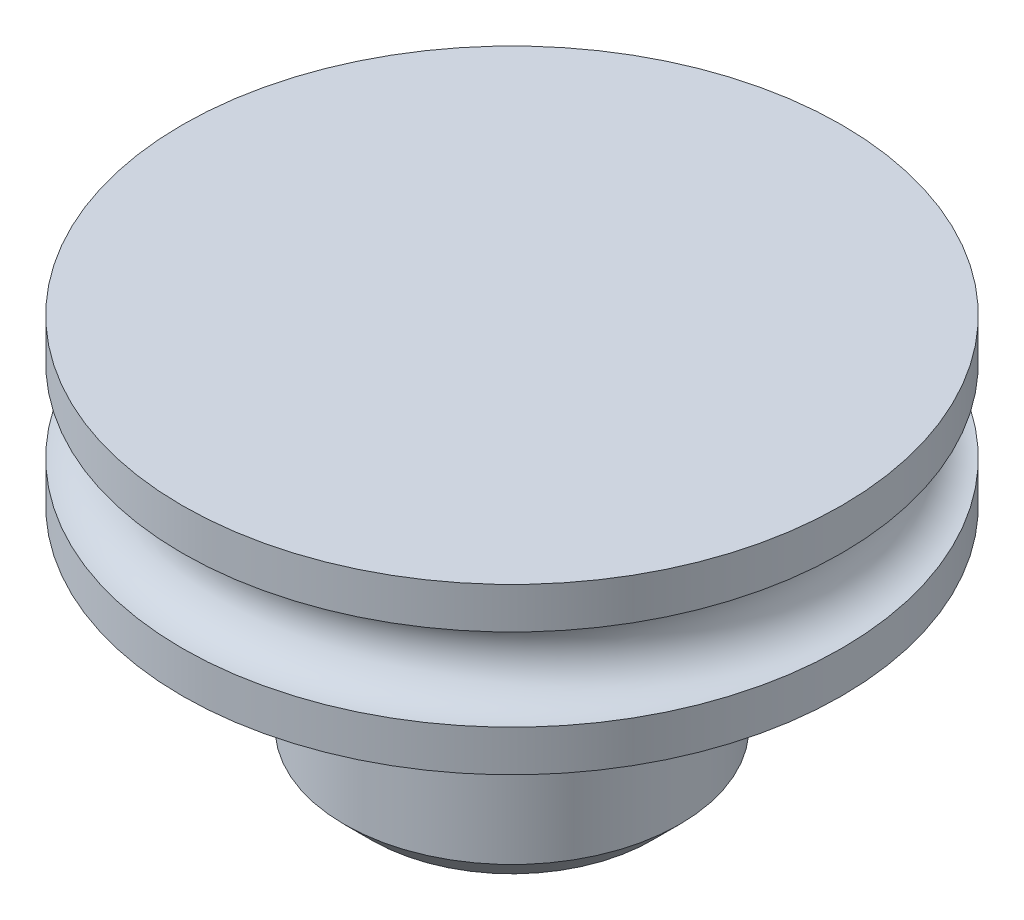
ISO-10303-21;
HEADER;
FILE_DESCRIPTION(('STEP AP214'),'2;1');
FILE_NAME('part.step','',(''),(''),'','','');
FILE_SCHEMA(('AUTOMOTIVE_DESIGN { 1 0 10303 214 1 1 1 1 }'));
ENDSEC;
DATA;
#1=APPLICATION_CONTEXT('core data for automotive mechanical design processes');
#2=APPLICATION_PROTOCOL_DEFINITION('international standard','automotive_design',2000,#1);
#3=PRODUCT_CONTEXT('',#1,'mechanical');
#4=PRODUCT('Part','Part','',(#3));
#5=PRODUCT_RELATED_PRODUCT_CATEGORY('part','',(#4));
#6=PRODUCT_DEFINITION_FORMATION('','',#4);
#7=PRODUCT_DEFINITION_CONTEXT('part definition',#1,'design');
#8=PRODUCT_DEFINITION('design','',#6,#7);
#9=PRODUCT_DEFINITION_SHAPE('','',#8);
#10=(LENGTH_UNIT() NAMED_UNIT(*) SI_UNIT(.MILLI.,.METRE.));
#11=(NAMED_UNIT(*) PLANE_ANGLE_UNIT() SI_UNIT($,.RADIAN.));
#12=(NAMED_UNIT(*) SI_UNIT($,.STERADIAN.) SOLID_ANGLE_UNIT());
#13=UNCERTAINTY_MEASURE_WITH_UNIT(LENGTH_MEASURE(1.E-05),#10,'distance_accuracy_value','');
#14=(GEOMETRIC_REPRESENTATION_CONTEXT(3) GLOBAL_UNCERTAINTY_ASSIGNED_CONTEXT((#13)) GLOBAL_UNIT_ASSIGNED_CONTEXT((#10,
#11,#12)) REPRESENTATION_CONTEXT('',''));
#15=CARTESIAN_POINT('',(0.,0.,0.));
#16=DIRECTION('',(0.,0.,1.));
#17=DIRECTION('',(1.,0.,0.));
#18=AXIS2_PLACEMENT_3D('',#15,#16,#17);
#19=CARTESIAN_POINT('',(0.,3.,0.));
#20=DIRECTION('',(0.,-1.,0.));
#21=DIRECTION('',(0.,0.,-1.));
#22=AXIS2_PLACEMENT_3D('',#19,#20,#21);
#23=CYLINDRICAL_SURFACE('',#22,3.05);
#24=CARTESIAN_POINT('',(0.,0.500000000000003,0.));
#25=DIRECTION('',(0.,1.,0.));
#26=DIRECTION('',(0.,0.,1.));
#27=AXIS2_PLACEMENT_3D('',#24,#25,#26);
#28=CIRCLE('',#27,3.05);
#29=CARTESIAN_POINT('',(0.,0.500000000000003,3.05));
#30=VERTEX_POINT('',#29);
#31=EDGE_CURVE('E47',#30,#30,#28,.T.);
#32=ORIENTED_EDGE('',*,*,#31,.T.);
#33=EDGE_LOOP('',(#32));
#34=FACE_BOUND('',#33,.T.);
#35=CARTESIAN_POINT('',(0.,3.,0.));
#36=DIRECTION('',(0.,1.,0.));
#37=DIRECTION('',(0.,0.,1.));
#38=AXIS2_PLACEMENT_3D('',#35,#36,#37);
#39=CIRCLE('',#38,3.05);
#40=CARTESIAN_POINT('',(0.,3.,3.05));
#41=VERTEX_POINT('',#40);
#42=EDGE_CURVE('E51',#41,#41,#39,.T.);
#43=ORIENTED_EDGE('',*,*,#42,.F.);
#44=EDGE_LOOP('',(#43));
#45=FACE_BOUND('',#44,.T.);
#46=ADVANCED_FACE('F39',(#34,#45),#23,.T.);
#47=CARTESIAN_POINT('',(0.,0.,0.));
#48=DIRECTION('',(0.,1.,0.));
#49=DIRECTION('',(0.,0.,1.));
#50=AXIS2_PLACEMENT_3D('',#47,#48,#49);
#51=PLANE('',#50);
#52=CARTESIAN_POINT('',(0.,0.,0.));
#53=DIRECTION('',(0.,1.,0.));
#54=DIRECTION('',(0.,0.,1.));
#55=AXIS2_PLACEMENT_3D('',#52,#53,#54);
#56=CIRCLE('',#55,2.54999999999999);
#57=CARTESIAN_POINT('',(0.,0.,2.54999999999999));
#58=VERTEX_POINT('',#57);
#59=EDGE_CURVE('E10',#58,#58,#56,.F.);
#60=ORIENTED_EDGE('',*,*,#59,.T.);
#61=EDGE_LOOP('',(#60));
#62=FACE_BOUND('',#61,.T.);
#63=ADVANCED_FACE('F98',(#62),#51,.F.);
#64=CARTESIAN_POINT('',(0.,4.,0.));
#65=DIRECTION('',(0.,-1.,0.));
#66=DIRECTION('',(0.,0.,-1.));
#67=AXIS2_PLACEMENT_3D('',#64,#65,#66);
#68=CYLINDRICAL_SURFACE('',#67,3.6);
#69=CARTESIAN_POINT('',(0.,4.,0.));
#70=DIRECTION('',(0.,1.,0.));
#71=DIRECTION('',(0.,0.,1.));
#72=AXIS2_PLACEMENT_3D('',#69,#70,#71);
#73=CIRCLE('',#72,3.6);
#74=CARTESIAN_POINT('',(0.,4.,3.6));
#75=VERTEX_POINT('',#74);
#76=EDGE_CURVE('E55',#75,#75,#73,.T.);
#77=ORIENTED_EDGE('',*,*,#76,.F.);
#78=EDGE_LOOP('',(#77));
#79=FACE_BOUND('',#78,.T.);
#80=CARTESIAN_POINT('',(0.,3.,0.));
#81=DIRECTION('',(0.,1.,0.));
#82=DIRECTION('',(0.,0.,1.));
#83=AXIS2_PLACEMENT_3D('',#80,#81,#82);
#84=CIRCLE('',#83,3.6);
#85=CARTESIAN_POINT('',(0.,3.,3.6));
#86=VERTEX_POINT('',#85);
#87=EDGE_CURVE('E65',#86,#86,#84,.T.);
#88=ORIENTED_EDGE('',*,*,#87,.T.);
#89=EDGE_LOOP('',(#88));
#90=FACE_BOUND('',#89,.T.);
#91=ADVANCED_FACE('F102',(#79,#90),#68,.T.);
#92=CARTESIAN_POINT('',(0.,3.,0.));
#93=DIRECTION('',(0.,1.,0.));
#94=DIRECTION('',(0.,0.,1.));
#95=AXIS2_PLACEMENT_3D('',#92,#93,#94);
#96=PLANE('',#95);
#97=ORIENTED_EDGE('',*,*,#42,.T.);
#98=EDGE_LOOP('',(#97));
#99=FACE_BOUND('',#98,.T.);
#100=ORIENTED_EDGE('',*,*,#87,.F.);
#101=EDGE_LOOP('',(#100));
#102=FACE_BOUND('',#101,.T.);
#103=ADVANCED_FACE('F96',(#99,#102),#96,.F.);
#104=CARTESIAN_POINT('',(0.,7.,0.));
#105=DIRECTION('',(0.,-1.,0.));
#106=DIRECTION('',(0.,0.,-1.));
#107=AXIS2_PLACEMENT_3D('',#104,#105,#106);
#108=CYLINDRICAL_SURFACE('',#107,6.);
#109=CARTESIAN_POINT('',(0.,4.75,0.));
#110=DIRECTION('',(0.,1.,0.));
#111=DIRECTION('',(0.,0.,1.));
#112=AXIS2_PLACEMENT_3D('',#109,#110,#111);
#113=CIRCLE('',#112,6.);
#114=CARTESIAN_POINT('',(0.,4.75,6.));
#115=VERTEX_POINT('',#114);
#116=EDGE_CURVE('E62',#115,#115,#113,.F.);
#117=ORIENTED_EDGE('',*,*,#116,.T.);
#118=EDGE_LOOP('',(#117));
#119=FACE_BOUND('',#118,.T.);
#120=CARTESIAN_POINT('',(0.,4.,0.));
#121=DIRECTION('',(0.,1.,0.));
#122=DIRECTION('',(0.,0.,1.));
#123=AXIS2_PLACEMENT_3D('',#120,#121,#122);
#124=CIRCLE('',#123,6.);
#125=CARTESIAN_POINT('',(0.,4.,6.));
#126=VERTEX_POINT('',#125);
#127=EDGE_CURVE('E61',#126,#126,#124,.T.);
#128=ORIENTED_EDGE('',*,*,#127,.T.);
#129=EDGE_LOOP('',(#128));
#130=FACE_BOUND('',#129,.T.);
#131=ADVANCED_FACE('F82',(#119,#130),#108,.T.);
#132=CARTESIAN_POINT('',(0.,4.,0.));
#133=DIRECTION('',(0.,1.,0.));
#134=DIRECTION('',(0.,0.,1.));
#135=AXIS2_PLACEMENT_3D('',#132,#133,#134);
#136=PLANE('',#135);
#137=ORIENTED_EDGE('',*,*,#76,.T.);
#138=EDGE_LOOP('',(#137));
#139=FACE_BOUND('',#138,.T.);
#140=ORIENTED_EDGE('',*,*,#127,.F.);
#141=EDGE_LOOP('',(#140));
#142=FACE_BOUND('',#141,.T.);
#143=ADVANCED_FACE('F95',(#139,#142),#136,.F.);
#144=CARTESIAN_POINT('',(0.,5.5,0.));
#145=DIRECTION('',(0.,1.,0.));
#146=DIRECTION('',(0.,0.,1.));
#147=AXIS2_PLACEMENT_3D('',#144,#145,#146);
#148=TOROIDAL_SURFACE('',#147,6.,0.749999999999999);
#149=ORIENTED_EDGE('',*,*,#116,.F.);
#150=EDGE_LOOP('',(#149));
#151=FACE_BOUND('',#150,.T.);
#152=CARTESIAN_POINT('',(0.,6.25,0.));
#153=DIRECTION('',(0.,-1.,0.));
#154=DIRECTION('',(0.,0.,-1.));
#155=AXIS2_PLACEMENT_3D('',#152,#153,#154);
#156=CIRCLE('',#155,6.);
#157=CARTESIAN_POINT('',(0.,6.25,-6.));
#158=VERTEX_POINT('',#157);
#159=EDGE_CURVE('E58',#158,#158,#156,.F.);
#160=ORIENTED_EDGE('',*,*,#159,.F.);
#161=EDGE_LOOP('',(#160));
#162=FACE_BOUND('',#161,.T.);
#163=ADVANCED_FACE('F90',(#151,#162),#148,.F.);
#164=CARTESIAN_POINT('',(0.,7.,0.));
#165=DIRECTION('',(0.,1.,0.));
#166=DIRECTION('',(0.,0.,1.));
#167=AXIS2_PLACEMENT_3D('',#164,#165,#166);
#168=PLANE('',#167);
#169=CARTESIAN_POINT('',(0.,7.,0.));
#170=DIRECTION('',(0.,1.,0.));
#171=DIRECTION('',(0.,0.,1.));
#172=AXIS2_PLACEMENT_3D('',#169,#170,#171);
#173=CIRCLE('',#172,6.);
#174=CARTESIAN_POINT('',(0.,7.,6.));
#175=VERTEX_POINT('',#174);
#176=EDGE_CURVE('E68',#175,#175,#173,.T.);
#177=ORIENTED_EDGE('',*,*,#176,.T.);
#178=EDGE_LOOP('',(#177));
#179=FACE_BOUND('',#178,.T.);
#180=ADVANCED_FACE('F76',(#179),#168,.T.);
#181=ORIENTED_EDGE('',*,*,#159,.T.);
#182=EDGE_LOOP('',(#181));
#183=FACE_BOUND('',#182,.T.);
#184=ORIENTED_EDGE('',*,*,#176,.F.);
#185=EDGE_LOOP('',(#184));
#186=FACE_BOUND('',#185,.T.);
#187=ADVANCED_FACE('F78',(#183,#186),#108,.T.);
#188=CARTESIAN_POINT('',(0.,0.500000000000003,0.));
#189=DIRECTION('',(0.,1.,0.));
#190=DIRECTION('',(0.,0.,1.));
#191=AXIS2_PLACEMENT_3D('',#188,#189,#190);
#192=CONICAL_SURFACE('',#191,3.05,0.78539816339745);
#193=ORIENTED_EDGE('',*,*,#59,.F.);
#194=EDGE_LOOP('',(#193));
#195=FACE_BOUND('',#194,.T.);
#196=ORIENTED_EDGE('',*,*,#31,.F.);
#197=EDGE_LOOP('',(#196));
#198=FACE_BOUND('',#197,.T.);
#199=ADVANCED_FACE('F42',(#195,#198),#192,.T.);
#200=CLOSED_SHELL('',(#46,#63,#91,#103,#131,#143,#163,#180,#187,#199));
#201=MANIFOLD_SOLID_BREP('B2',#200);
#202=ADVANCED_BREP_SHAPE_REPRESENTATION('',(#18,#201),#14);
#203=SHAPE_DEFINITION_REPRESENTATION(#9,#202);
ENDSEC;
END-ISO-10303-21;
